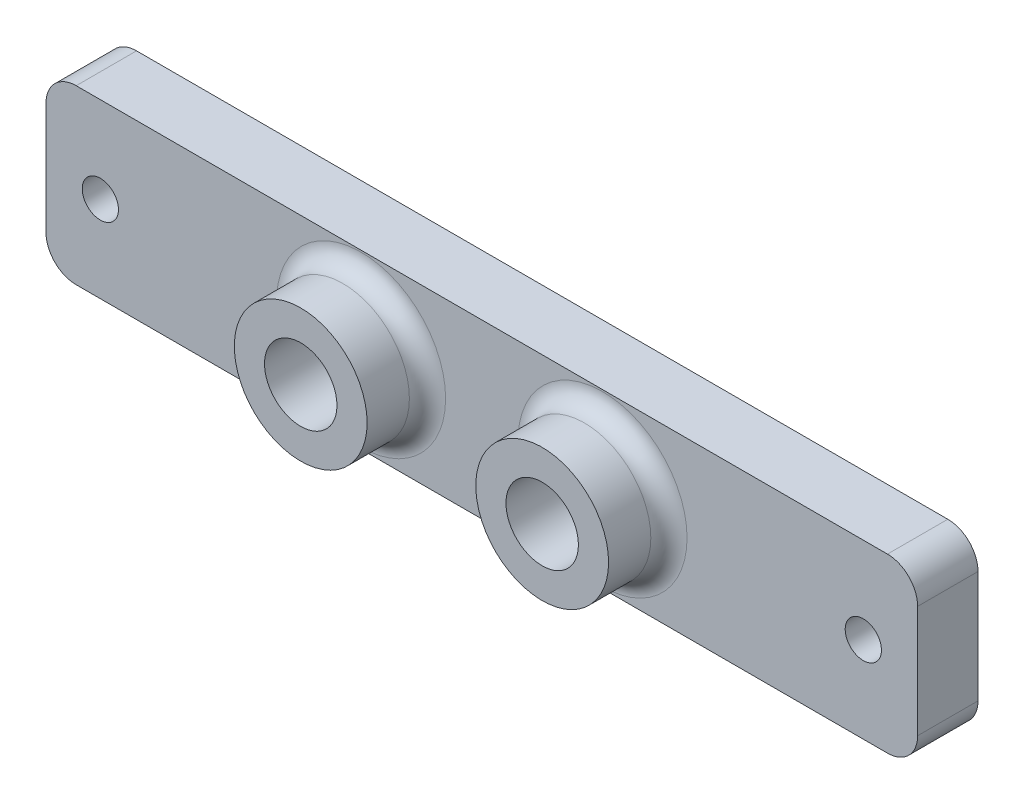
ISO-10303-21;
HEADER;
FILE_DESCRIPTION(('STEP AP214'),'2;1');
FILE_NAME('part.step','',(''),(''),'','','');
FILE_SCHEMA(('AUTOMOTIVE_DESIGN { 1 0 10303 214 1 1 1 1 }'));
ENDSEC;
DATA;
#1=APPLICATION_CONTEXT('core data for automotive mechanical design processes');
#2=APPLICATION_PROTOCOL_DEFINITION('international standard','automotive_design',2000,#1);
#3=PRODUCT_CONTEXT('',#1,'mechanical');
#4=PRODUCT('Part','Part','',(#3));
#5=PRODUCT_RELATED_PRODUCT_CATEGORY('part','',(#4));
#6=PRODUCT_DEFINITION_FORMATION('','',#4);
#7=PRODUCT_DEFINITION_CONTEXT('part definition',#1,'design');
#8=PRODUCT_DEFINITION('design','',#6,#7);
#9=PRODUCT_DEFINITION_SHAPE('','',#8);
#10=(LENGTH_UNIT() NAMED_UNIT(*) SI_UNIT(.MILLI.,.METRE.));
#11=(NAMED_UNIT(*) PLANE_ANGLE_UNIT() SI_UNIT($,.RADIAN.));
#12=(NAMED_UNIT(*) SI_UNIT($,.STERADIAN.) SOLID_ANGLE_UNIT());
#13=UNCERTAINTY_MEASURE_WITH_UNIT(LENGTH_MEASURE(1.E-05),#10,'distance_accuracy_value','');
#14=(GEOMETRIC_REPRESENTATION_CONTEXT(3) GLOBAL_UNCERTAINTY_ASSIGNED_CONTEXT((#13)) GLOBAL_UNIT_ASSIGNED_CONTEXT((#10,
#11,#12)) REPRESENTATION_CONTEXT('',''));
#15=CARTESIAN_POINT('',(0.,0.,0.));
#16=DIRECTION('',(0.,0.,1.));
#17=DIRECTION('',(1.,0.,0.));
#18=AXIS2_PLACEMENT_3D('',#15,#16,#17);
#19=CARTESIAN_POINT('',(0.,0.,5.));
#20=DIRECTION('',(0.,0.,1.));
#21=DIRECTION('',(1.,0.,0.));
#22=AXIS2_PLACEMENT_3D('',#19,#20,#21);
#23=PLANE('',#22);
#24=CARTESIAN_POINT('',(10.,0.,5.));
#25=DIRECTION('',(0.,0.,1.));
#26=DIRECTION('',(1.,0.,0.));
#27=AXIS2_PLACEMENT_3D('',#24,#25,#26);
#28=CIRCLE('',#27,7.);
#29=CARTESIAN_POINT('',(17.,0.,5.));
#30=VERTEX_POINT('',#29);
#31=EDGE_CURVE('E52',#30,#30,#28,.F.);
#32=ORIENTED_EDGE('',*,*,#31,.T.);
#33=EDGE_LOOP('',(#32));
#34=FACE_BOUND('',#33,.T.);
#35=CARTESIAN_POINT('',(-10.,0.,5.));
#36=DIRECTION('',(0.,0.,1.));
#37=DIRECTION('',(1.,0.,0.));
#38=AXIS2_PLACEMENT_3D('',#35,#36,#37);
#39=CIRCLE('',#38,7.);
#40=CARTESIAN_POINT('',(-3.,0.,5.));
#41=VERTEX_POINT('',#40);
#42=EDGE_CURVE('E193',#41,#41,#39,.F.);
#43=ORIENTED_EDGE('',*,*,#42,.T.);
#44=EDGE_LOOP('',(#43));
#45=FACE_BOUND('',#44,.T.);
#46=CARTESIAN_POINT('',(-31.6,0.,5.));
#47=DIRECTION('',(0.,0.,1.));
#48=DIRECTION('',(1.,0.,0.));
#49=AXIS2_PLACEMENT_3D('',#46,#47,#48);
#50=CIRCLE('',#49,1.5);
#51=CARTESIAN_POINT('',(-30.1,0.,5.));
#52=VERTEX_POINT('',#51);
#53=EDGE_CURVE('E144',#52,#52,#50,.T.);
#54=ORIENTED_EDGE('',*,*,#53,.F.);
#55=EDGE_LOOP('',(#54));
#56=FACE_BOUND('',#55,.T.);
#57=CARTESIAN_POINT('',(31.6,0.,5.));
#58=DIRECTION('',(0.,0.,1.));
#59=DIRECTION('',(1.,0.,0.));
#60=AXIS2_PLACEMENT_3D('',#57,#58,#59);
#61=CIRCLE('',#60,1.5);
#62=CARTESIAN_POINT('',(33.1,0.,5.));
#63=VERTEX_POINT('',#62);
#64=EDGE_CURVE('E235',#63,#63,#61,.T.);
#65=ORIENTED_EDGE('',*,*,#64,.F.);
#66=EDGE_LOOP('',(#65));
#67=FACE_BOUND('',#66,.T.);
#68=DIRECTION('',(-1.,0.,0.));
#69=VECTOR('',#68,1.);
#70=CARTESIAN_POINT('',(0.,-7.14,5.));
#71=LINE('',#70,#69);
#72=CARTESIAN_POINT('',(33.6,-7.14,5.));
#73=VERTEX_POINT('',#72);
#74=CARTESIAN_POINT('',(-33.6,-7.14,5.));
#75=VERTEX_POINT('',#74);
#76=EDGE_CURVE('E243',#73,#75,#71,.T.);
#77=ORIENTED_EDGE('',*,*,#76,.F.);
#78=CARTESIAN_POINT('',(33.6,-4.64,5.));
#79=DIRECTION('',(0.,0.,1.));
#80=DIRECTION('',(1.,0.,0.));
#81=AXIS2_PLACEMENT_3D('',#78,#79,#80);
#82=CIRCLE('',#81,2.5);
#83=CARTESIAN_POINT('',(36.1,-4.64,5.));
#84=VERTEX_POINT('',#83);
#85=EDGE_CURVE('E173',#73,#84,#82,.T.);
#86=ORIENTED_EDGE('',*,*,#85,.T.);
#87=DIRECTION('',(0.,1.,0.));
#88=VECTOR('',#87,1.);
#89=CARTESIAN_POINT('',(36.1,0.,5.));
#90=LINE('',#89,#88);
#91=CARTESIAN_POINT('',(36.1,4.64000000000001,5.));
#92=VERTEX_POINT('',#91);
#93=EDGE_CURVE('E131',#84,#92,#90,.T.);
#94=ORIENTED_EDGE('',*,*,#93,.T.);
#95=CARTESIAN_POINT('',(33.6,4.64000000000001,5.));
#96=DIRECTION('',(0.,0.,1.));
#97=DIRECTION('',(1.,0.,0.));
#98=AXIS2_PLACEMENT_3D('',#95,#96,#97);
#99=CIRCLE('',#98,2.5);
#100=CARTESIAN_POINT('',(33.6,7.14000000000001,5.));
#101=VERTEX_POINT('',#100);
#102=EDGE_CURVE('E66',#92,#101,#99,.T.);
#103=ORIENTED_EDGE('',*,*,#102,.T.);
#104=DIRECTION('',(-1.,0.,0.));
#105=VECTOR('',#104,1.);
#106=CARTESIAN_POINT('',(0.,7.14,5.));
#107=LINE('',#106,#105);
#108=CARTESIAN_POINT('',(-33.6,7.14,5.));
#109=VERTEX_POINT('',#108);
#110=EDGE_CURVE('E151',#101,#109,#107,.T.);
#111=ORIENTED_EDGE('',*,*,#110,.T.);
#112=CARTESIAN_POINT('',(-33.6,4.64,5.));
#113=DIRECTION('',(0.,0.,1.));
#114=DIRECTION('',(1.,0.,0.));
#115=AXIS2_PLACEMENT_3D('',#112,#113,#114);
#116=CIRCLE('',#115,2.5);
#117=CARTESIAN_POINT('',(-36.1,4.64,5.));
#118=VERTEX_POINT('',#117);
#119=EDGE_CURVE('E167',#109,#118,#116,.T.);
#120=ORIENTED_EDGE('',*,*,#119,.T.);
#121=DIRECTION('',(0.,1.,0.));
#122=VECTOR('',#121,1.);
#123=CARTESIAN_POINT('',(-36.1,0.,5.));
#124=LINE('',#123,#122);
#125=CARTESIAN_POINT('',(-36.1,-4.64,5.));
#126=VERTEX_POINT('',#125);
#127=EDGE_CURVE('E239',#126,#118,#124,.T.);
#128=ORIENTED_EDGE('',*,*,#127,.F.);
#129=CARTESIAN_POINT('',(-33.6,-4.64,5.));
#130=DIRECTION('',(0.,0.,1.));
#131=DIRECTION('',(1.,0.,0.));
#132=AXIS2_PLACEMENT_3D('',#129,#130,#131);
#133=CIRCLE('',#132,2.5);
#134=EDGE_CURVE('E170',#126,#75,#133,.T.);
#135=ORIENTED_EDGE('',*,*,#134,.T.);
#136=EDGE_LOOP('',(#77,#86,#94,#103,#111,#120,#128,#135));
#137=FACE_BOUND('',#136,.T.);
#138=ADVANCED_FACE('F43',(#34,#45,#56,#67,#137),#23,.T.);
#139=CARTESIAN_POINT('',(-36.1,0.,5.));
#140=DIRECTION('',(-1.,0.,0.));
#141=DIRECTION('',(0.,0.,1.));
#142=AXIS2_PLACEMENT_3D('',#139,#140,#141);
#143=PLANE('',#142);
#144=DIRECTION('',(0.,1.,0.));
#145=VECTOR('',#144,1.);
#146=CARTESIAN_POINT('',(-36.1,0.,0.));
#147=LINE('',#146,#145);
#148=CARTESIAN_POINT('',(-36.1,-4.64,0.));
#149=VERTEX_POINT('',#148);
#150=CARTESIAN_POINT('',(-36.1,4.64,0.));
#151=VERTEX_POINT('',#150);
#152=EDGE_CURVE('E146',#149,#151,#147,.T.);
#153=ORIENTED_EDGE('',*,*,#152,.F.);
#154=DIRECTION('',(0.,0.,-1.));
#155=VECTOR('',#154,1.);
#156=CARTESIAN_POINT('',(-36.1,-4.64,5.));
#157=LINE('',#156,#155);
#158=EDGE_CURVE('E180',#149,#126,#157,.F.);
#159=ORIENTED_EDGE('',*,*,#158,.T.);
#160=ORIENTED_EDGE('',*,*,#127,.T.);
#161=DIRECTION('',(0.,0.,-1.));
#162=VECTOR('',#161,1.);
#163=CARTESIAN_POINT('',(-36.1,4.64,0.));
#164=LINE('',#163,#162);
#165=EDGE_CURVE('E176',#118,#151,#164,.T.);
#166=ORIENTED_EDGE('',*,*,#165,.T.);
#167=EDGE_LOOP('',(#153,#159,#160,#166));
#168=FACE_BOUND('',#167,.T.);
#169=ADVANCED_FACE('F270',(#168),#143,.T.);
#170=CARTESIAN_POINT('',(0.,-7.14,5.));
#171=DIRECTION('',(0.,-1.,0.));
#172=DIRECTION('',(1.,0.,0.));
#173=AXIS2_PLACEMENT_3D('',#170,#171,#172);
#174=PLANE('',#173);
#175=DIRECTION('',(-1.,0.,0.));
#176=VECTOR('',#175,1.);
#177=CARTESIAN_POINT('',(0.,-7.14,0.));
#178=LINE('',#177,#176);
#179=CARTESIAN_POINT('',(33.6,-7.14,0.));
#180=VERTEX_POINT('',#179);
#181=CARTESIAN_POINT('',(-33.6,-7.14,0.));
#182=VERTEX_POINT('',#181);
#183=EDGE_CURVE('E140',#180,#182,#178,.T.);
#184=ORIENTED_EDGE('',*,*,#183,.F.);
#185=DIRECTION('',(0.,0.,-1.));
#186=VECTOR('',#185,1.);
#187=CARTESIAN_POINT('',(33.6,-7.14,5.));
#188=LINE('',#187,#186);
#189=EDGE_CURVE('E116',#180,#73,#188,.F.);
#190=ORIENTED_EDGE('',*,*,#189,.T.);
#191=ORIENTED_EDGE('',*,*,#76,.T.);
#192=DIRECTION('',(0.,0.,-1.));
#193=VECTOR('',#192,1.);
#194=CARTESIAN_POINT('',(-33.6,-7.14,5.));
#195=LINE('',#194,#193);
#196=EDGE_CURVE('E122',#75,#182,#195,.T.);
#197=ORIENTED_EDGE('',*,*,#196,.T.);
#198=EDGE_LOOP('',(#184,#190,#191,#197));
#199=FACE_BOUND('',#198,.T.);
#200=ADVANCED_FACE('F279',(#199),#174,.T.);
#201=CARTESIAN_POINT('',(36.1,0.,5.));
#202=DIRECTION('',(-1.,0.,0.));
#203=DIRECTION('',(0.,0.,1.));
#204=AXIS2_PLACEMENT_3D('',#201,#202,#203);
#205=PLANE('',#204);
#206=ORIENTED_EDGE('',*,*,#93,.F.);
#207=DIRECTION('',(0.,0.,-1.));
#208=VECTOR('',#207,1.);
#209=CARTESIAN_POINT('',(36.1,-4.64,0.));
#210=LINE('',#209,#208);
#211=CARTESIAN_POINT('',(36.1,-4.64,0.));
#212=VERTEX_POINT('',#211);
#213=EDGE_CURVE('E115',#84,#212,#210,.T.);
#214=ORIENTED_EDGE('',*,*,#213,.T.);
#215=DIRECTION('',(0.,1.,0.));
#216=VECTOR('',#215,1.);
#217=CARTESIAN_POINT('',(36.1,0.,0.));
#218=LINE('',#217,#216);
#219=CARTESIAN_POINT('',(36.1,4.64000000000001,0.));
#220=VERTEX_POINT('',#219);
#221=EDGE_CURVE('E129',#212,#220,#218,.T.);
#222=ORIENTED_EDGE('',*,*,#221,.T.);
#223=DIRECTION('',(0.,0.,-1.));
#224=VECTOR('',#223,1.);
#225=CARTESIAN_POINT('',(36.1,4.64000000000001,5.));
#226=LINE('',#225,#224);
#227=EDGE_CURVE('E134',#220,#92,#226,.F.);
#228=ORIENTED_EDGE('',*,*,#227,.T.);
#229=EDGE_LOOP('',(#206,#214,#222,#228));
#230=FACE_BOUND('',#229,.T.);
#231=ADVANCED_FACE('F128',(#230),#205,.F.);
#232=CARTESIAN_POINT('',(31.6,0.,5.));
#233=DIRECTION('',(0.,0.,-1.));
#234=DIRECTION('',(-1.,0.,0.));
#235=AXIS2_PLACEMENT_3D('',#232,#233,#234);
#236=CYLINDRICAL_SURFACE('',#235,1.5);
#237=ORIENTED_EDGE('',*,*,#64,.T.);
#238=EDGE_LOOP('',(#237));
#239=FACE_BOUND('',#238,.T.);
#240=CARTESIAN_POINT('',(31.6,0.,0.));
#241=DIRECTION('',(0.,0.,1.));
#242=DIRECTION('',(1.,0.,0.));
#243=AXIS2_PLACEMENT_3D('',#240,#241,#242);
#244=CIRCLE('',#243,1.5);
#245=CARTESIAN_POINT('',(33.1,0.,0.));
#246=VERTEX_POINT('',#245);
#247=EDGE_CURVE('E262',#246,#246,#244,.T.);
#248=ORIENTED_EDGE('',*,*,#247,.F.);
#249=EDGE_LOOP('',(#248));
#250=FACE_BOUND('',#249,.T.);
#251=ADVANCED_FACE('F286',(#239,#250),#236,.F.);
#252=CARTESIAN_POINT('',(-31.6,0.,5.));
#253=DIRECTION('',(0.,0.,-1.));
#254=DIRECTION('',(-1.,0.,0.));
#255=AXIS2_PLACEMENT_3D('',#252,#253,#254);
#256=CYLINDRICAL_SURFACE('',#255,1.5);
#257=ORIENTED_EDGE('',*,*,#53,.T.);
#258=EDGE_LOOP('',(#257));
#259=FACE_BOUND('',#258,.T.);
#260=CARTESIAN_POINT('',(-31.6,0.,0.));
#261=DIRECTION('',(0.,0.,1.));
#262=DIRECTION('',(1.,0.,0.));
#263=AXIS2_PLACEMENT_3D('',#260,#261,#262);
#264=CIRCLE('',#263,1.5);
#265=CARTESIAN_POINT('',(-30.1,0.,0.));
#266=VERTEX_POINT('',#265);
#267=EDGE_CURVE('E258',#266,#266,#264,.T.);
#268=ORIENTED_EDGE('',*,*,#267,.F.);
#269=EDGE_LOOP('',(#268));
#270=FACE_BOUND('',#269,.T.);
#271=ADVANCED_FACE('F334',(#259,#270),#256,.F.);
#272=CARTESIAN_POINT('',(10.,0.,5.));
#273=DIRECTION('',(0.,0.,-1.));
#274=DIRECTION('',(-1.,0.,0.));
#275=AXIS2_PLACEMENT_3D('',#272,#273,#274);
#276=CYLINDRICAL_SURFACE('',#275,3.);
#277=CARTESIAN_POINT('',(10.,0.,0.));
#278=DIRECTION('',(0.,0.,1.));
#279=DIRECTION('',(1.,0.,0.));
#280=AXIS2_PLACEMENT_3D('',#277,#278,#279);
#281=CIRCLE('',#280,3.);
#282=CARTESIAN_POINT('',(13.,0.,0.));
#283=VERTEX_POINT('',#282);
#284=EDGE_CURVE('E254',#283,#283,#281,.T.);
#285=ORIENTED_EDGE('',*,*,#284,.F.);
#286=EDGE_LOOP('',(#285));
#287=FACE_BOUND('',#286,.T.);
#288=CARTESIAN_POINT('',(10.,0.,10.));
#289=DIRECTION('',(0.,0.,1.));
#290=DIRECTION('',(1.,0.,0.));
#291=AXIS2_PLACEMENT_3D('',#288,#289,#290);
#292=CIRCLE('',#291,3.);
#293=CARTESIAN_POINT('',(13.,0.,10.));
#294=VERTEX_POINT('',#293);
#295=EDGE_CURVE('E218',#294,#294,#292,.T.);
#296=ORIENTED_EDGE('',*,*,#295,.T.);
#297=EDGE_LOOP('',(#296));
#298=FACE_BOUND('',#297,.T.);
#299=ADVANCED_FACE('F309',(#287,#298),#276,.F.);
#300=CARTESIAN_POINT('',(-10.,0.,5.));
#301=DIRECTION('',(0.,0.,-1.));
#302=DIRECTION('',(-1.,0.,0.));
#303=AXIS2_PLACEMENT_3D('',#300,#301,#302);
#304=CYLINDRICAL_SURFACE('',#303,3.);
#305=CARTESIAN_POINT('',(-10.,0.,0.));
#306=DIRECTION('',(0.,0.,1.));
#307=DIRECTION('',(1.,0.,0.));
#308=AXIS2_PLACEMENT_3D('',#305,#306,#307);
#309=CIRCLE('',#308,3.);
#310=CARTESIAN_POINT('',(-7.,0.,0.));
#311=VERTEX_POINT('',#310);
#312=EDGE_CURVE('E231',#311,#311,#309,.T.);
#313=ORIENTED_EDGE('',*,*,#312,.F.);
#314=EDGE_LOOP('',(#313));
#315=FACE_BOUND('',#314,.T.);
#316=CARTESIAN_POINT('',(-10.,0.,10.));
#317=DIRECTION('',(0.,0.,1.));
#318=DIRECTION('',(1.,0.,0.));
#319=AXIS2_PLACEMENT_3D('',#316,#317,#318);
#320=CIRCLE('',#319,3.);
#321=CARTESIAN_POINT('',(-7.,0.,10.));
#322=VERTEX_POINT('',#321);
#323=EDGE_CURVE('E217',#322,#322,#320,.T.);
#324=ORIENTED_EDGE('',*,*,#323,.T.);
#325=EDGE_LOOP('',(#324));
#326=FACE_BOUND('',#325,.T.);
#327=ADVANCED_FACE('F304',(#315,#326),#304,.F.);
#328=CARTESIAN_POINT('',(0.,7.14,5.));
#329=DIRECTION('',(0.,-1.,0.));
#330=DIRECTION('',(1.,0.,0.));
#331=AXIS2_PLACEMENT_3D('',#328,#329,#330);
#332=PLANE('',#331);
#333=DIRECTION('',(-1.,0.,0.));
#334=VECTOR('',#333,1.);
#335=CARTESIAN_POINT('',(0.,7.14,0.));
#336=LINE('',#335,#334);
#337=CARTESIAN_POINT('',(33.6,7.14000000000001,0.));
#338=VERTEX_POINT('',#337);
#339=CARTESIAN_POINT('',(-33.6,7.14,0.));
#340=VERTEX_POINT('',#339);
#341=EDGE_CURVE('E139',#338,#340,#336,.T.);
#342=ORIENTED_EDGE('',*,*,#341,.T.);
#343=DIRECTION('',(0.,0.,-1.));
#344=VECTOR('',#343,1.);
#345=CARTESIAN_POINT('',(-33.6,7.14,5.));
#346=LINE('',#345,#344);
#347=EDGE_CURVE('E59',#340,#109,#346,.F.);
#348=ORIENTED_EDGE('',*,*,#347,.T.);
#349=ORIENTED_EDGE('',*,*,#110,.F.);
#350=DIRECTION('',(0.,0.,-1.));
#351=VECTOR('',#350,1.);
#352=CARTESIAN_POINT('',(33.6,7.14000000000001,5.));
#353=LINE('',#352,#351);
#354=EDGE_CURVE('E183',#101,#338,#353,.T.);
#355=ORIENTED_EDGE('',*,*,#354,.T.);
#356=EDGE_LOOP('',(#342,#348,#349,#355));
#357=FACE_BOUND('',#356,.T.);
#358=ADVANCED_FACE('F301',(#357),#332,.F.);
#359=CARTESIAN_POINT('',(0.,0.,0.));
#360=DIRECTION('',(0.,0.,1.));
#361=DIRECTION('',(1.,0.,0.));
#362=AXIS2_PLACEMENT_3D('',#359,#360,#361);
#363=PLANE('',#362);
#364=ORIENTED_EDGE('',*,*,#312,.T.);
#365=EDGE_LOOP('',(#364));
#366=FACE_BOUND('',#365,.T.);
#367=ORIENTED_EDGE('',*,*,#284,.T.);
#368=EDGE_LOOP('',(#367));
#369=FACE_BOUND('',#368,.T.);
#370=ORIENTED_EDGE('',*,*,#267,.T.);
#371=EDGE_LOOP('',(#370));
#372=FACE_BOUND('',#371,.T.);
#373=ORIENTED_EDGE('',*,*,#247,.T.);
#374=EDGE_LOOP('',(#373));
#375=FACE_BOUND('',#374,.T.);
#376=ORIENTED_EDGE('',*,*,#221,.F.);
#377=CARTESIAN_POINT('',(33.6,-4.64,0.));
#378=DIRECTION('',(0.,0.,1.));
#379=DIRECTION('',(1.,0.,0.));
#380=AXIS2_PLACEMENT_3D('',#377,#378,#379);
#381=CIRCLE('',#380,2.5);
#382=EDGE_CURVE('E111',#212,#180,#381,.F.);
#383=ORIENTED_EDGE('',*,*,#382,.T.);
#384=ORIENTED_EDGE('',*,*,#183,.T.);
#385=CARTESIAN_POINT('',(-33.6,-4.64,0.));
#386=DIRECTION('',(0.,0.,1.));
#387=DIRECTION('',(1.,0.,0.));
#388=AXIS2_PLACEMENT_3D('',#385,#386,#387);
#389=CIRCLE('',#388,2.5);
#390=EDGE_CURVE('E123',#182,#149,#389,.F.);
#391=ORIENTED_EDGE('',*,*,#390,.T.);
#392=ORIENTED_EDGE('',*,*,#152,.T.);
#393=CARTESIAN_POINT('',(-33.6,4.64,0.));
#394=DIRECTION('',(0.,0.,1.));
#395=DIRECTION('',(1.,0.,0.));
#396=AXIS2_PLACEMENT_3D('',#393,#394,#395);
#397=CIRCLE('',#396,2.5);
#398=EDGE_CURVE('E155',#151,#340,#397,.F.);
#399=ORIENTED_EDGE('',*,*,#398,.T.);
#400=ORIENTED_EDGE('',*,*,#341,.F.);
#401=CARTESIAN_POINT('',(33.6,4.64000000000001,0.));
#402=DIRECTION('',(0.,0.,1.));
#403=DIRECTION('',(1.,0.,0.));
#404=AXIS2_PLACEMENT_3D('',#401,#402,#403);
#405=CIRCLE('',#404,2.5);
#406=EDGE_CURVE('E133',#338,#220,#405,.F.);
#407=ORIENTED_EDGE('',*,*,#406,.T.);
#408=EDGE_LOOP('',(#376,#383,#384,#391,#392,#399,#400,#407));
#409=FACE_BOUND('',#408,.T.);
#410=ADVANCED_FACE('F136',(#366,#369,#372,#375,#409),#363,.F.);
#411=CARTESIAN_POINT('',(33.6,-4.64,5.));
#412=DIRECTION('',(0.,0.,1.));
#413=DIRECTION('',(1.,0.,0.));
#414=AXIS2_PLACEMENT_3D('',#411,#412,#413);
#415=CYLINDRICAL_SURFACE('',#414,2.5);
#416=ORIENTED_EDGE('',*,*,#85,.F.);
#417=ORIENTED_EDGE('',*,*,#189,.F.);
#418=ORIENTED_EDGE('',*,*,#382,.F.);
#419=ORIENTED_EDGE('',*,*,#213,.F.);
#420=EDGE_LOOP('',(#416,#417,#418,#419));
#421=FACE_BOUND('',#420,.T.);
#422=ADVANCED_FACE('F114',(#421),#415,.T.);
#423=CARTESIAN_POINT('',(-33.6,-4.64,5.));
#424=DIRECTION('',(0.,0.,-1.));
#425=DIRECTION('',(-1.,0.,0.));
#426=AXIS2_PLACEMENT_3D('',#423,#424,#425);
#427=CYLINDRICAL_SURFACE('',#426,2.5);
#428=ORIENTED_EDGE('',*,*,#134,.F.);
#429=ORIENTED_EDGE('',*,*,#158,.F.);
#430=ORIENTED_EDGE('',*,*,#390,.F.);
#431=ORIENTED_EDGE('',*,*,#196,.F.);
#432=EDGE_LOOP('',(#428,#429,#430,#431));
#433=FACE_BOUND('',#432,.T.);
#434=ADVANCED_FACE('F275',(#433),#427,.T.);
#435=CARTESIAN_POINT('',(-33.6,4.64,5.));
#436=DIRECTION('',(0.,0.,1.));
#437=DIRECTION('',(1.,0.,0.));
#438=AXIS2_PLACEMENT_3D('',#435,#436,#437);
#439=CYLINDRICAL_SURFACE('',#438,2.5);
#440=ORIENTED_EDGE('',*,*,#119,.F.);
#441=ORIENTED_EDGE('',*,*,#347,.F.);
#442=ORIENTED_EDGE('',*,*,#398,.F.);
#443=ORIENTED_EDGE('',*,*,#165,.F.);
#444=EDGE_LOOP('',(#440,#441,#442,#443));
#445=FACE_BOUND('',#444,.T.);
#446=ADVANCED_FACE('F315',(#445),#439,.T.);
#447=CARTESIAN_POINT('',(33.6,4.64000000000001,5.));
#448=DIRECTION('',(0.,0.,-1.));
#449=DIRECTION('',(-1.,0.,0.));
#450=AXIS2_PLACEMENT_3D('',#447,#448,#449);
#451=CYLINDRICAL_SURFACE('',#450,2.5);
#452=ORIENTED_EDGE('',*,*,#102,.F.);
#453=ORIENTED_EDGE('',*,*,#227,.F.);
#454=ORIENTED_EDGE('',*,*,#406,.F.);
#455=ORIENTED_EDGE('',*,*,#354,.F.);
#456=EDGE_LOOP('',(#452,#453,#454,#455));
#457=FACE_BOUND('',#456,.T.);
#458=ADVANCED_FACE('F317',(#457),#451,.T.);
#459=CARTESIAN_POINT('',(-10.,0.,10.));
#460=DIRECTION('',(0.,0.,1.));
#461=DIRECTION('',(1.,0.,0.));
#462=AXIS2_PLACEMENT_3D('',#459,#460,#461);
#463=PLANE('',#462);
#464=CARTESIAN_POINT('',(-10.,0.,10.));
#465=DIRECTION('',(0.,0.,1.));
#466=DIRECTION('',(1.,0.,0.));
#467=AXIS2_PLACEMENT_3D('',#464,#465,#466);
#468=CIRCLE('',#467,5.5);
#469=CARTESIAN_POINT('',(-4.5,0.,10.));
#470=VERTEX_POINT('',#469);
#471=EDGE_CURVE('E223',#470,#470,#468,.T.);
#472=ORIENTED_EDGE('',*,*,#471,.T.);
#473=EDGE_LOOP('',(#472));
#474=FACE_BOUND('',#473,.T.);
#475=ORIENTED_EDGE('',*,*,#323,.F.);
#476=EDGE_LOOP('',(#475));
#477=FACE_BOUND('',#476,.T.);
#478=ADVANCED_FACE('F319',(#474,#477),#463,.T.);
#479=CARTESIAN_POINT('',(-10.,0.,10.));
#480=DIRECTION('',(0.,0.,-1.));
#481=DIRECTION('',(-1.,0.,0.));
#482=AXIS2_PLACEMENT_3D('',#479,#480,#481);
#483=CYLINDRICAL_SURFACE('',#482,5.5);
#484=CARTESIAN_POINT('',(-10.,0.,6.5));
#485=DIRECTION('',(0.,0.,1.));
#486=DIRECTION('',(1.,0.,0.));
#487=AXIS2_PLACEMENT_3D('',#484,#485,#486);
#488=CIRCLE('',#487,5.5);
#489=CARTESIAN_POINT('',(-4.5,0.,6.5));
#490=VERTEX_POINT('',#489);
#491=EDGE_CURVE('E11',#490,#490,#488,.T.);
#492=ORIENTED_EDGE('',*,*,#491,.T.);
#493=EDGE_LOOP('',(#492));
#494=FACE_BOUND('',#493,.T.);
#495=ORIENTED_EDGE('',*,*,#471,.F.);
#496=EDGE_LOOP('',(#495));
#497=FACE_BOUND('',#496,.T.);
#498=ADVANCED_FACE('F297',(#494,#497),#483,.T.);
#499=CARTESIAN_POINT('',(10.,0.,10.));
#500=DIRECTION('',(0.,0.,1.));
#501=DIRECTION('',(1.,0.,0.));
#502=AXIS2_PLACEMENT_3D('',#499,#500,#501);
#503=PLANE('',#502);
#504=CARTESIAN_POINT('',(10.,0.,10.));
#505=DIRECTION('',(0.,0.,1.));
#506=DIRECTION('',(1.,0.,0.));
#507=AXIS2_PLACEMENT_3D('',#504,#505,#506);
#508=CIRCLE('',#507,5.5);
#509=CARTESIAN_POINT('',(15.5,0.,10.));
#510=VERTEX_POINT('',#509);
#511=EDGE_CURVE('E214',#510,#510,#508,.T.);
#512=ORIENTED_EDGE('',*,*,#511,.T.);
#513=EDGE_LOOP('',(#512));
#514=FACE_BOUND('',#513,.T.);
#515=ORIENTED_EDGE('',*,*,#295,.F.);
#516=EDGE_LOOP('',(#515));
#517=FACE_BOUND('',#516,.T.);
#518=ADVANCED_FACE('F210',(#514,#517),#503,.T.);
#519=CARTESIAN_POINT('',(10.,0.,10.));
#520=DIRECTION('',(0.,0.,-1.));
#521=DIRECTION('',(-1.,0.,0.));
#522=AXIS2_PLACEMENT_3D('',#519,#520,#521);
#523=CYLINDRICAL_SURFACE('',#522,5.5);
#524=CARTESIAN_POINT('',(10.,0.,6.5));
#525=DIRECTION('',(0.,0.,1.));
#526=DIRECTION('',(1.,0.,0.));
#527=AXIS2_PLACEMENT_3D('',#524,#525,#526);
#528=CIRCLE('',#527,5.5);
#529=CARTESIAN_POINT('',(15.5,0.,6.5));
#530=VERTEX_POINT('',#529);
#531=EDGE_CURVE('E189',#530,#530,#528,.T.);
#532=ORIENTED_EDGE('',*,*,#531,.T.);
#533=EDGE_LOOP('',(#532));
#534=FACE_BOUND('',#533,.T.);
#535=ORIENTED_EDGE('',*,*,#511,.F.);
#536=EDGE_LOOP('',(#535));
#537=FACE_BOUND('',#536,.T.);
#538=ADVANCED_FACE('F205',(#534,#537),#523,.T.);
#539=CARTESIAN_POINT('',(10.,0.,6.5));
#540=DIRECTION('',(0.,0.,1.));
#541=DIRECTION('',(1.,0.,0.));
#542=AXIS2_PLACEMENT_3D('',#539,#540,#541);
#543=TOROIDAL_SURFACE('',#542,7.,1.5);
#544=ORIENTED_EDGE('',*,*,#31,.F.);
#545=EDGE_LOOP('',(#544));
#546=FACE_BOUND('',#545,.T.);
#547=ORIENTED_EDGE('',*,*,#531,.F.);
#548=EDGE_LOOP('',(#547));
#549=FACE_BOUND('',#548,.T.);
#550=ADVANCED_FACE('F202',(#546,#549),#543,.F.);
#551=CARTESIAN_POINT('',(-10.,0.,6.5));
#552=DIRECTION('',(0.,0.,1.));
#553=DIRECTION('',(1.,0.,0.));
#554=AXIS2_PLACEMENT_3D('',#551,#552,#553);
#555=TOROIDAL_SURFACE('',#554,7.,1.5);
#556=ORIENTED_EDGE('',*,*,#42,.F.);
#557=EDGE_LOOP('',(#556));
#558=FACE_BOUND('',#557,.T.);
#559=ORIENTED_EDGE('',*,*,#491,.F.);
#560=EDGE_LOOP('',(#559));
#561=FACE_BOUND('',#560,.T.);
#562=ADVANCED_FACE('F45',(#558,#561),#555,.F.);
#563=CLOSED_SHELL('',(#138,#169,#200,#231,#251,#271,#299,#327,#358,#410,#422,#434,#446,#458,
#478,#498,#518,#538,#550,#562));
#564=MANIFOLD_SOLID_BREP('B2',#563);
#565=ADVANCED_BREP_SHAPE_REPRESENTATION('',(#18,#564),#14);
#566=SHAPE_DEFINITION_REPRESENTATION(#9,#565);
ENDSEC;
END-ISO-10303-21;
